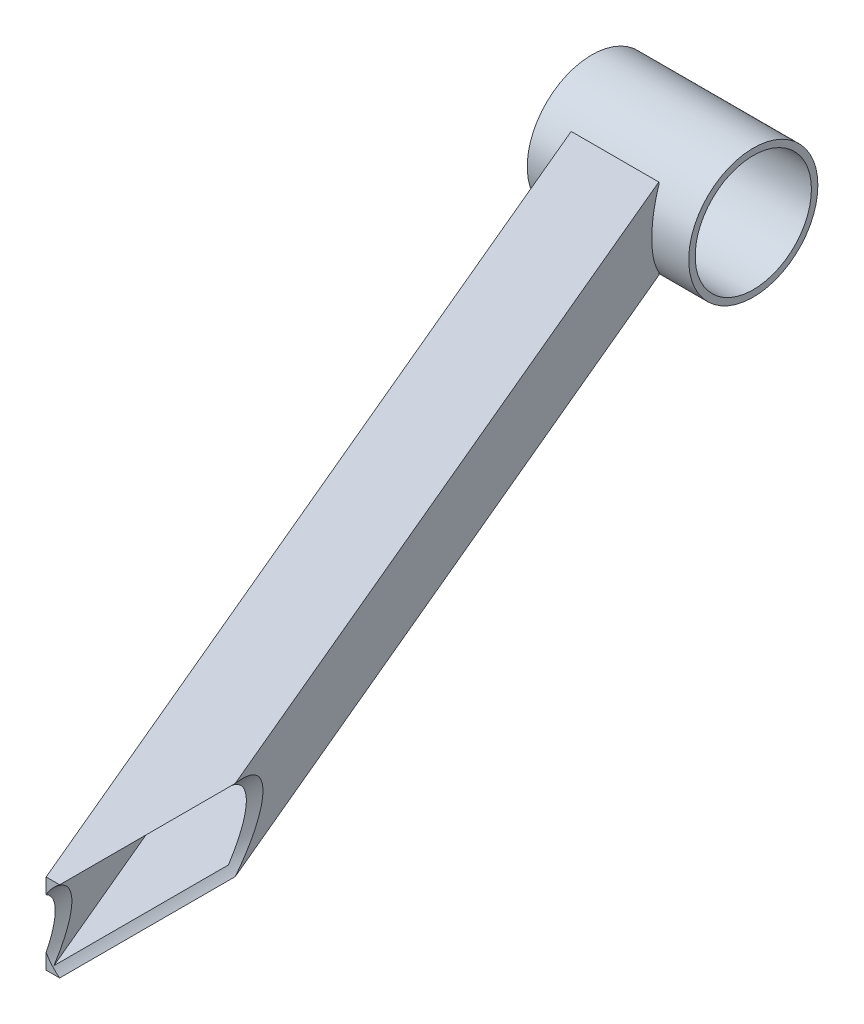
ISO-10303-21;
HEADER;
FILE_DESCRIPTION(('STEP AP214'),'2;1');
FILE_NAME('part.step','',(''),(''),'','','');
FILE_SCHEMA(('AUTOMOTIVE_DESIGN { 1 0 10303 214 1 1 1 1 }'));
ENDSEC;
DATA;
#1=APPLICATION_CONTEXT('core data for automotive mechanical design processes');
#2=APPLICATION_PROTOCOL_DEFINITION('international standard','automotive_design',2000,#1);
#3=PRODUCT_CONTEXT('',#1,'mechanical');
#4=PRODUCT('Part','Part','',(#3));
#5=PRODUCT_RELATED_PRODUCT_CATEGORY('part','',(#4));
#6=PRODUCT_DEFINITION_FORMATION('','',#4);
#7=PRODUCT_DEFINITION_CONTEXT('part definition',#1,'design');
#8=PRODUCT_DEFINITION('design','',#6,#7);
#9=PRODUCT_DEFINITION_SHAPE('','',#8);
#10=(LENGTH_UNIT() NAMED_UNIT(*) SI_UNIT(.MILLI.,.METRE.));
#11=(NAMED_UNIT(*) PLANE_ANGLE_UNIT() SI_UNIT($,.RADIAN.));
#12=(NAMED_UNIT(*) SI_UNIT($,.STERADIAN.) SOLID_ANGLE_UNIT());
#13=UNCERTAINTY_MEASURE_WITH_UNIT(LENGTH_MEASURE(1.E-05),#10,'distance_accuracy_value','');
#14=(GEOMETRIC_REPRESENTATION_CONTEXT(3) GLOBAL_UNCERTAINTY_ASSIGNED_CONTEXT((#13)) GLOBAL_UNIT_ASSIGNED_CONTEXT((#10,
#11,#12)) REPRESENTATION_CONTEXT('',''));
#15=CARTESIAN_POINT('',(0.,0.,0.));
#16=DIRECTION('',(0.,0.,1.));
#17=DIRECTION('',(1.,0.,0.));
#18=AXIS2_PLACEMENT_3D('',#15,#16,#17);
#19=CARTESIAN_POINT('',(113.650728546452,9.99999999999995,462.989935880595));
#20=DIRECTION('',(0.,0.,-1.));
#21=DIRECTION('',(0.,1.,0.));
#22=AXIS2_PLACEMENT_3D('',#19,#20,#21);
#23=PLANE('',#22);
#24=DIRECTION('',(1.,0.,0.));
#25=VECTOR('',#24,1.);
#26=CARTESIAN_POINT('',(113.650728546452,-10.0000000000001,462.989935880595));
#27=LINE('',#26,#25);
#28=CARTESIAN_POINT('',(102.797279016029,-10.0000000000001,462.989935880595));
#29=VERTEX_POINT('',#28);
#30=CARTESIAN_POINT('',(106.150728546452,-9.99999999999994,462.989935880595));
#31=VERTEX_POINT('',#30);
#32=EDGE_CURVE('E179',#29,#31,#27,.T.);
#33=ORIENTED_EDGE('',*,*,#32,.T.);
#34=CARTESIAN_POINT('',(113.650728546452,0.,462.989935880595));
#35=DIRECTION('',(0.,0.,-1.));
#36=DIRECTION('',(0.,1.,0.));
#37=AXIS2_PLACEMENT_3D('',#34,#35,#36);
#38=CIRCLE('',#37,12.5);
#39=CARTESIAN_POINT('',(102.797279016029,-6.20101873006179,462.989935880595));
#40=VERTEX_POINT('',#39);
#41=EDGE_CURVE('E503',#31,#40,#38,.T.);
#42=ORIENTED_EDGE('',*,*,#41,.T.);
#43=DIRECTION('',(0.,-1.,0.));
#44=VECTOR('',#43,1.);
#45=CARTESIAN_POINT('',(102.797279016029,9.99999999999995,462.989935880595));
#46=LINE('',#45,#44);
#47=EDGE_CURVE('E186',#40,#29,#46,.T.);
#48=ORIENTED_EDGE('',*,*,#47,.T.);
#49=EDGE_LOOP('',(#33,#42,#48));
#50=FACE_BOUND('',#49,.T.);
#51=ADVANCED_FACE('F44',(#50),#23,.F.);
#52=CARTESIAN_POINT('',(102.797279016029,9.99999999999995,462.989935880595));
#53=VERTEX_POINT('',#52);
#54=CARTESIAN_POINT('',(102.797279016029,6.20101873006165,462.989935880595));
#55=VERTEX_POINT('',#54);
#56=EDGE_CURVE('E196',#53,#55,#46,.T.);
#57=ORIENTED_EDGE('',*,*,#56,.T.);
#58=CARTESIAN_POINT('',(106.150728546452,9.99999999999995,462.989935880595));
#59=VERTEX_POINT('',#58);
#60=EDGE_CURVE('E499',#55,#59,#38,.T.);
#61=ORIENTED_EDGE('',*,*,#60,.T.);
#62=DIRECTION('',(1.,0.,0.));
#63=VECTOR('',#62,1.);
#64=CARTESIAN_POINT('',(113.650728546452,9.99999999999995,462.989935880595));
#65=LINE('',#64,#63);
#66=EDGE_CURVE('E175',#53,#59,#65,.T.);
#67=ORIENTED_EDGE('',*,*,#66,.F.);
#68=EDGE_LOOP('',(#57,#61,#67));
#69=FACE_BOUND('',#68,.T.);
#70=ADVANCED_FACE('F298',(#69),#23,.F.);
#71=CARTESIAN_POINT('',(0.,-10.,0.));
#72=DIRECTION('',(0.,1.,0.));
#73=DIRECTION('',(0.,0.,1.));
#74=AXIS2_PLACEMENT_3D('',#71,#72,#73);
#75=PLANE('',#74);
#76=DIRECTION('',(-0.38869601076738,0.,-0.921366057120363));
#77=VECTOR('',#76,1.);
#78=CARTESIAN_POINT('',(113.274761854631,-10.,436.371697818349));
#79=LINE('',#78,#77);
#80=CARTESIAN_POINT('',(106.150728546452,-10.,419.484870328165));
#81=VERTEX_POINT('',#80);
#82=CARTESIAN_POINT('',(29.5878417697601,-10.,238.));
#83=VERTEX_POINT('',#82);
#84=EDGE_CURVE('E173',#81,#83,#79,.T.);
#85=ORIENTED_EDGE('',*,*,#84,.F.);
#86=DIRECTION('',(0.,0.,-1.));
#87=VECTOR('',#86,1.);
#88=CARTESIAN_POINT('',(106.150728546452,-10.0000000000001,467.989935880595));
#89=LINE('',#88,#87);
#90=EDGE_CURVE('E261',#81,#31,#89,.F.);
#91=ORIENTED_EDGE('',*,*,#90,.T.);
#92=ORIENTED_EDGE('',*,*,#32,.F.);
#93=DIRECTION('',(0.38869601076738,0.,0.921366057120363));
#94=VECTOR('',#93,1.);
#95=CARTESIAN_POINT('',(102.797279016029,-10.0000000000001,462.989935880595));
#96=LINE('',#95,#94);
#97=CARTESIAN_POINT('',(7.88094270891566,-10.,238.));
#98=VERTEX_POINT('',#97);
#99=EDGE_CURVE('E191',#98,#29,#96,.T.);
#100=ORIENTED_EDGE('',*,*,#99,.F.);
#101=DIRECTION('',(-1.,0.,0.));
#102=VECTOR('',#101,1.);
#103=CARTESIAN_POINT('',(7.88094270891566,-10.,238.));
#104=LINE('',#103,#102);
#105=EDGE_CURVE('E188',#83,#98,#104,.T.);
#106=ORIENTED_EDGE('',*,*,#105,.F.);
#107=EDGE_LOOP('',(#85,#91,#92,#100,#106));
#108=FACE_BOUND('',#107,.T.);
#109=ADVANCED_FACE('F266',(#108),#75,.F.);
#110=CARTESIAN_POINT('',(0.,10.,0.));
#111=DIRECTION('',(0.,1.,0.));
#112=DIRECTION('',(0.,0.,1.));
#113=AXIS2_PLACEMENT_3D('',#110,#111,#112);
#114=PLANE('',#113);
#115=DIRECTION('',(0.,0.,-1.));
#116=VECTOR('',#115,1.);
#117=CARTESIAN_POINT('',(106.150728546452,9.99999999999995,467.989935880595));
#118=LINE('',#117,#116);
#119=CARTESIAN_POINT('',(106.150728546452,10.0000000000001,419.484870328165));
#120=VERTEX_POINT('',#119);
#121=EDGE_CURVE('E257',#120,#59,#118,.F.);
#122=ORIENTED_EDGE('',*,*,#121,.F.);
#123=DIRECTION('',(-0.38869601076738,0.,-0.921366057120363));
#124=VECTOR('',#123,1.);
#125=CARTESIAN_POINT('',(113.274761854631,9.99999999999995,436.371697818349));
#126=LINE('',#125,#124);
#127=CARTESIAN_POINT('',(29.5878417697601,9.99999999999997,238.));
#128=VERTEX_POINT('',#127);
#129=EDGE_CURVE('E178',#120,#128,#126,.T.);
#130=ORIENTED_EDGE('',*,*,#129,.T.);
#131=DIRECTION('',(-1.,0.,0.));
#132=VECTOR('',#131,1.);
#133=CARTESIAN_POINT('',(7.88094270891566,9.99999999999997,238.));
#134=LINE('',#133,#132);
#135=CARTESIAN_POINT('',(7.88094270891566,9.99999999999997,238.));
#136=VERTEX_POINT('',#135);
#137=EDGE_CURVE('E181',#128,#136,#134,.T.);
#138=ORIENTED_EDGE('',*,*,#137,.T.);
#139=DIRECTION('',(0.38869601076738,0.,0.921366057120363));
#140=VECTOR('',#139,1.);
#141=CARTESIAN_POINT('',(102.797279016029,9.99999999999995,462.989935880595));
#142=LINE('',#141,#140);
#143=EDGE_CURVE('E183',#136,#53,#142,.T.);
#144=ORIENTED_EDGE('',*,*,#143,.T.);
#145=ORIENTED_EDGE('',*,*,#66,.T.);
#146=EDGE_LOOP('',(#122,#130,#138,#144,#145));
#147=FACE_BOUND('',#146,.T.);
#148=ADVANCED_FACE('F255',(#147),#114,.T.);
#149=CARTESIAN_POINT('',(40.,0.,225.));
#150=DIRECTION('',(-1.,0.,0.));
#151=DIRECTION('',(0.,0.,1.));
#152=AXIS2_PLACEMENT_3D('',#149,#150,#151);
#153=CYLINDRICAL_SURFACE('',#152,14.4);
#154=CARTESIAN_POINT('',(40.,0.,225.));
#155=DIRECTION('',(1.,0.,0.));
#156=DIRECTION('',(0.,0.,-1.));
#157=AXIS2_PLACEMENT_3D('',#154,#155,#156);
#158=CIRCLE('',#157,14.4);
#159=CARTESIAN_POINT('',(40.,0.,210.6));
#160=VERTEX_POINT('',#159);
#161=EDGE_CURVE('E221',#160,#160,#158,.T.);
#162=ORIENTED_EDGE('',*,*,#161,.T.);
#163=EDGE_LOOP('',(#162));
#164=FACE_BOUND('',#163,.T.);
#165=CARTESIAN_POINT('',(0.,0.,225.));
#166=DIRECTION('',(1.,0.,0.));
#167=DIRECTION('',(0.,0.,-1.));
#168=AXIS2_PLACEMENT_3D('',#165,#166,#167);
#169=CIRCLE('',#168,14.4);
#170=CARTESIAN_POINT('',(0.,0.,210.6));
#171=VERTEX_POINT('',#170);
#172=EDGE_CURVE('E220',#171,#171,#169,.T.);
#173=ORIENTED_EDGE('',*,*,#172,.F.);
#174=EDGE_LOOP('',(#173));
#175=FACE_BOUND('',#174,.T.);
#176=DIRECTION('',(-1.,0.,0.));
#177=VECTOR('',#176,1.);
#178=CARTESIAN_POINT('',(40.,-6.1935450268808,238.));
#179=LINE('',#178,#177);
#180=CARTESIAN_POINT('',(7.88094270891566,-6.1935450268808,238.));
#181=VERTEX_POINT('',#180);
#182=CARTESIAN_POINT('',(29.5878417697601,-6.1935450268808,238.));
#183=VERTEX_POINT('',#182);
#184=EDGE_CURVE('E211',#181,#183,#179,.F.);
#185=ORIENTED_EDGE('',*,*,#184,.T.);
#186=CARTESIAN_POINT('',(24.1035414735579,0.,225.));
#187=DIRECTION('',(-0.921366057120363,0.,0.38869601076738));
#188=DIRECTION('',(-0.38869601076738,0.,-0.921366057120363));
#189=AXIS2_PLACEMENT_3D('',#186,#187,#188);
#190=ELLIPSE('',#189,15.628967323808,14.4);
#191=CARTESIAN_POINT('',(29.5878417697601,6.19354502688079,238.));
#192=VERTEX_POINT('',#191);
#193=EDGE_CURVE('E217',#183,#192,#190,.T.);
#194=ORIENTED_EDGE('',*,*,#193,.T.);
#195=DIRECTION('',(-1.,0.,0.));
#196=VECTOR('',#195,1.);
#197=CARTESIAN_POINT('',(40.,6.19354502688079,238.));
#198=LINE('',#197,#196);
#199=CARTESIAN_POINT('',(7.88094270891566,6.1935450268808,238.));
#200=VERTEX_POINT('',#199);
#201=EDGE_CURVE('E214',#192,#200,#198,.T.);
#202=ORIENTED_EDGE('',*,*,#201,.T.);
#203=CARTESIAN_POINT('',(2.39664241271337,0.,225.));
#204=DIRECTION('',(0.921366057120363,0.,-0.38869601076738));
#205=DIRECTION('',(-0.38869601076738,0.,-0.921366057120363));
#206=AXIS2_PLACEMENT_3D('',#203,#204,#205);
#207=ELLIPSE('',#206,15.628967323808,14.4);
#208=EDGE_CURVE('E207',#200,#181,#207,.T.);
#209=ORIENTED_EDGE('',*,*,#208,.T.);
#210=EDGE_LOOP('',(#185,#194,#202,#209));
#211=FACE_BOUND('',#210,.T.);
#212=ADVANCED_FACE('F46',(#164,#175,#211),#153,.F.);
#213=CARTESIAN_POINT('',(40.,0.,225.));
#214=DIRECTION('',(-1.,0.,0.));
#215=DIRECTION('',(0.,0.,1.));
#216=AXIS2_PLACEMENT_3D('',#213,#214,#215);
#217=CYLINDRICAL_SURFACE('',#216,16.);
#218=CARTESIAN_POINT('',(0.,0.,225.));
#219=DIRECTION('',(1.,0.,0.));
#220=DIRECTION('',(0.,0.,-1.));
#221=AXIS2_PLACEMENT_3D('',#218,#219,#220);
#222=CIRCLE('',#221,16.);
#223=CARTESIAN_POINT('',(0.,0.,209.));
#224=VERTEX_POINT('',#223);
#225=EDGE_CURVE('E225',#224,#224,#222,.T.);
#226=ORIENTED_EDGE('',*,*,#225,.T.);
#227=EDGE_LOOP('',(#226));
#228=FACE_BOUND('',#227,.T.);
#229=CARTESIAN_POINT('',(40.,0.,225.));
#230=DIRECTION('',(1.,0.,0.));
#231=DIRECTION('',(0.,0.,-1.));
#232=AXIS2_PLACEMENT_3D('',#229,#230,#231);
#233=CIRCLE('',#232,16.);
#234=CARTESIAN_POINT('',(40.,0.,209.));
#235=VERTEX_POINT('',#234);
#236=EDGE_CURVE('E224',#235,#235,#233,.T.);
#237=ORIENTED_EDGE('',*,*,#236,.F.);
#238=EDGE_LOOP('',(#237));
#239=FACE_BOUND('',#238,.T.);
#240=CARTESIAN_POINT('',(24.1035414735579,0.,225.));
#241=DIRECTION('',(-0.921366057120363,0.,0.38869601076738));
#242=DIRECTION('',(-0.38869601076738,0.,-0.921366057120363));
#243=AXIS2_PLACEMENT_3D('',#240,#241,#242);
#244=ELLIPSE('',#243,17.3655192486756,16.);
#245=CARTESIAN_POINT('',(29.5878417697601,-9.32737905308884,238.));
#246=VERTEX_POINT('',#245);
#247=CARTESIAN_POINT('',(29.5878417697601,9.32737905308884,238.));
#248=VERTEX_POINT('',#247);
#249=EDGE_CURVE('E52',#246,#248,#244,.T.);
#250=ORIENTED_EDGE('',*,*,#249,.F.);
#251=DIRECTION('',(-1.,0.,0.));
#252=VECTOR('',#251,1.);
#253=CARTESIAN_POINT('',(40.,-9.32737905308884,238.));
#254=LINE('',#253,#252);
#255=CARTESIAN_POINT('',(7.88094270891566,-9.32737905308884,238.));
#256=VERTEX_POINT('',#255);
#257=EDGE_CURVE('E235',#256,#246,#254,.F.);
#258=ORIENTED_EDGE('',*,*,#257,.F.);
#259=CARTESIAN_POINT('',(2.39664241271337,0.,225.));
#260=DIRECTION('',(0.921366057120363,0.,-0.38869601076738));
#261=DIRECTION('',(-0.38869601076738,0.,-0.921366057120363));
#262=AXIS2_PLACEMENT_3D('',#259,#260,#261);
#263=ELLIPSE('',#262,17.3655192486756,16.);
#264=CARTESIAN_POINT('',(7.88094270891566,9.32737905308884,238.));
#265=VERTEX_POINT('',#264);
#266=EDGE_CURVE('E228',#265,#256,#263,.T.);
#267=ORIENTED_EDGE('',*,*,#266,.F.);
#268=DIRECTION('',(-1.,0.,0.));
#269=VECTOR('',#268,1.);
#270=CARTESIAN_POINT('',(40.,9.32737905308884,238.));
#271=LINE('',#270,#269);
#272=EDGE_CURVE('E238',#248,#265,#271,.T.);
#273=ORIENTED_EDGE('',*,*,#272,.F.);
#274=EDGE_LOOP('',(#250,#258,#267,#273));
#275=FACE_BOUND('',#274,.T.);
#276=ADVANCED_FACE('F282',(#228,#239,#275),#217,.T.);
#277=CARTESIAN_POINT('',(40.,0.,0.));
#278=DIRECTION('',(1.,0.,0.));
#279=DIRECTION('',(0.,0.,-1.));
#280=AXIS2_PLACEMENT_3D('',#277,#278,#279);
#281=PLANE('',#280);
#282=ORIENTED_EDGE('',*,*,#161,.F.);
#283=EDGE_LOOP('',(#282));
#284=FACE_BOUND('',#283,.T.);
#285=ORIENTED_EDGE('',*,*,#236,.T.);
#286=EDGE_LOOP('',(#285));
#287=FACE_BOUND('',#286,.T.);
#288=ADVANCED_FACE('F284',(#284,#287),#281,.T.);
#289=CARTESIAN_POINT('',(0.,0.,0.));
#290=DIRECTION('',(1.,0.,0.));
#291=DIRECTION('',(0.,0.,-1.));
#292=AXIS2_PLACEMENT_3D('',#289,#290,#291);
#293=PLANE('',#292);
#294=ORIENTED_EDGE('',*,*,#172,.T.);
#295=EDGE_LOOP('',(#294));
#296=FACE_BOUND('',#295,.T.);
#297=ORIENTED_EDGE('',*,*,#225,.F.);
#298=EDGE_LOOP('',(#297));
#299=FACE_BOUND('',#298,.T.);
#300=ADVANCED_FACE('F291',(#296,#299),#293,.F.);
#301=CARTESIAN_POINT('',(102.797279016029,9.99999999999995,462.989935880595));
#302=DIRECTION('',(0.921366057120363,0.,-0.38869601076738));
#303=DIRECTION('',(-0.38869601076738,0.,-0.921366057120363));
#304=AXIS2_PLACEMENT_3D('',#301,#302,#303);
#305=PLANE('',#304);
#306=ORIENTED_EDGE('',*,*,#47,.F.);
#307=CARTESIAN_POINT('',(113.650728546452,0.,488.716981497188));
#308=DIRECTION('',(0.921366057120363,0.,-0.38869601076738));
#309=DIRECTION('',(-0.38869601076738,0.,-0.921366057120363));
#310=AXIS2_PLACEMENT_3D('',#307,#308,#309);
#311=ELLIPSE('',#310,32.1588070207409,12.5);
#312=EDGE_CURVE('E505',#40,#55,#311,.T.);
#313=ORIENTED_EDGE('',*,*,#312,.T.);
#314=ORIENTED_EDGE('',*,*,#56,.F.);
#315=ORIENTED_EDGE('',*,*,#143,.F.);
#316=DIRECTION('',(0.,-1.,0.));
#317=VECTOR('',#316,1.);
#318=CARTESIAN_POINT('',(7.88094270891566,9.99999999999997,238.));
#319=LINE('',#318,#317);
#320=EDGE_CURVE('E200',#136,#265,#319,.T.);
#321=ORIENTED_EDGE('',*,*,#320,.T.);
#322=ORIENTED_EDGE('',*,*,#266,.T.);
#323=EDGE_CURVE('E199',#256,#98,#319,.T.);
#324=ORIENTED_EDGE('',*,*,#323,.T.);
#325=ORIENTED_EDGE('',*,*,#99,.T.);
#326=EDGE_LOOP('',(#306,#313,#314,#315,#321,#322,#324,#325));
#327=FACE_BOUND('',#326,.T.);
#328=ADVANCED_FACE('F281',(#327),#305,.F.);
#329=CARTESIAN_POINT('',(113.274761854631,9.99999999999995,436.371697818349));
#330=DIRECTION('',(-0.921366057120363,0.,0.38869601076738));
#331=DIRECTION('',(0.38869601076738,0.,0.921366057120363));
#332=AXIS2_PLACEMENT_3D('',#329,#330,#331);
#333=PLANE('',#332);
#334=ORIENTED_EDGE('',*,*,#129,.F.);
#335=CARTESIAN_POINT('',(113.650728546452,0.,437.262890264002));
#336=DIRECTION('',(-0.921366057120363,0.,0.38869601076738));
#337=DIRECTION('',(-0.38869601076738,0.,-0.921366057120363));
#338=AXIS2_PLACEMENT_3D('',#335,#336,#337);
#339=ELLIPSE('',#338,32.1588070207409,12.5);
#340=EDGE_CURVE('E259',#120,#81,#339,.T.);
#341=ORIENTED_EDGE('',*,*,#340,.T.);
#342=ORIENTED_EDGE('',*,*,#84,.T.);
#343=DIRECTION('',(0.,-1.,0.));
#344=VECTOR('',#343,1.);
#345=CARTESIAN_POINT('',(29.5878417697601,9.99999999999997,238.));
#346=LINE('',#345,#344);
#347=EDGE_CURVE('E203',#246,#83,#346,.T.);
#348=ORIENTED_EDGE('',*,*,#347,.F.);
#349=ORIENTED_EDGE('',*,*,#249,.T.);
#350=EDGE_CURVE('E204',#128,#248,#346,.T.);
#351=ORIENTED_EDGE('',*,*,#350,.F.);
#352=EDGE_LOOP('',(#334,#341,#342,#348,#349,#351));
#353=FACE_BOUND('',#352,.T.);
#354=ADVANCED_FACE('F245',(#353),#333,.F.);
#355=CARTESIAN_POINT('',(7.88094270891566,9.99999999999997,238.));
#356=DIRECTION('',(0.,0.,1.));
#357=DIRECTION('',(0.,-1.,0.));
#358=AXIS2_PLACEMENT_3D('',#355,#356,#357);
#359=PLANE('',#358);
#360=ORIENTED_EDGE('',*,*,#323,.F.);
#361=ORIENTED_EDGE('',*,*,#257,.T.);
#362=ORIENTED_EDGE('',*,*,#347,.T.);
#363=ORIENTED_EDGE('',*,*,#105,.T.);
#364=EDGE_LOOP('',(#360,#361,#362,#363));
#365=FACE_BOUND('',#364,.T.);
#366=ADVANCED_FACE('F271',(#365),#359,.F.);
#367=ORIENTED_EDGE('',*,*,#350,.T.);
#368=ORIENTED_EDGE('',*,*,#272,.T.);
#369=ORIENTED_EDGE('',*,*,#320,.F.);
#370=ORIENTED_EDGE('',*,*,#137,.F.);
#371=EDGE_LOOP('',(#367,#368,#369,#370));
#372=FACE_BOUND('',#371,.T.);
#373=ADVANCED_FACE('F250',(#372),#359,.F.);
#374=ORIENTED_EDGE('',*,*,#193,.F.);
#375=EDGE_CURVE('E208',#192,#183,#346,.T.);
#376=ORIENTED_EDGE('',*,*,#375,.F.);
#377=EDGE_LOOP('',(#374,#376));
#378=FACE_BOUND('',#377,.T.);
#379=ADVANCED_FACE('F315',(#378),#333,.F.);
#380=ORIENTED_EDGE('',*,*,#208,.F.);
#381=EDGE_CURVE('E66',#200,#181,#319,.T.);
#382=ORIENTED_EDGE('',*,*,#381,.T.);
#383=EDGE_LOOP('',(#380,#382));
#384=FACE_BOUND('',#383,.T.);
#385=ADVANCED_FACE('F278',(#384),#305,.F.);
#386=ORIENTED_EDGE('',*,*,#201,.F.);
#387=ORIENTED_EDGE('',*,*,#375,.T.);
#388=ORIENTED_EDGE('',*,*,#184,.F.);
#389=ORIENTED_EDGE('',*,*,#381,.F.);
#390=EDGE_LOOP('',(#386,#387,#388,#389));
#391=FACE_BOUND('',#390,.T.);
#392=ADVANCED_FACE('F275',(#391),#359,.F.);
#393=CARTESIAN_POINT('',(113.650728546452,0.,-543.71784351505));
#394=DIRECTION('',(0.,0.,1.));
#395=DIRECTION('',(1.,0.,0.));
#396=AXIS2_PLACEMENT_3D('',#393,#394,#395);
#397=CYLINDRICAL_SURFACE('',#396,12.5);
#398=CARTESIAN_POINT('',(113.650728546452,0.,441.379217562657));
#399=DIRECTION('',(-0.921366057120363,0.,0.38869601076738));
#400=DIRECTION('',(-0.38869601076738,0.,-0.921366057120363));
#401=AXIS2_PLACEMENT_3D('',#398,#399,#400);
#402=ELLIPSE('',#401,32.1588070207409,12.5);
#403=CARTESIAN_POINT('',(104.393839220118,8.40000000000001,419.43666249767));
#404=VERTEX_POINT('',#403);
#405=CARTESIAN_POINT('',(104.393839220117,-8.39999999999994,419.43666249767));
#406=VERTEX_POINT('',#405);
#407=EDGE_CURVE('E11',#404,#406,#402,.T.);
#408=ORIENTED_EDGE('',*,*,#407,.T.);
#409=DIRECTION('',(0.,0.,-1.));
#410=VECTOR('',#409,1.);
#411=CARTESIAN_POINT('',(104.393839220118,-8.40000000000005,467.989935880595));
#412=LINE('',#411,#410);
#413=CARTESIAN_POINT('',(104.393839220118,-8.40000000000004,462.658099133546));
#414=VERTEX_POINT('',#413);
#415=EDGE_CURVE('E495',#406,#414,#412,.F.);
#416=ORIENTED_EDGE('',*,*,#415,.T.);
#417=CARTESIAN_POINT('',(113.650728546452,0.,484.600654198533));
#418=DIRECTION('',(0.921366057120363,0.,-0.38869601076738));
#419=DIRECTION('',(-0.38869601076738,0.,-0.921366057120363));
#420=AXIS2_PLACEMENT_3D('',#417,#418,#419);
#421=ELLIPSE('',#420,32.1588070207409,12.5);
#422=CARTESIAN_POINT('',(104.393839220118,8.39999999999995,462.658099133546));
#423=VERTEX_POINT('',#422);
#424=EDGE_CURVE('E59',#414,#423,#421,.T.);
#425=ORIENTED_EDGE('',*,*,#424,.T.);
#426=DIRECTION('',(0.,0.,-1.));
#427=VECTOR('',#426,1.);
#428=CARTESIAN_POINT('',(104.393839220118,8.39999999999995,467.989935880595));
#429=LINE('',#428,#427);
#430=EDGE_CURVE('E141',#404,#423,#429,.F.);
#431=ORIENTED_EDGE('',*,*,#430,.F.);
#432=EDGE_LOOP('',(#408,#416,#425,#431));
#433=FACE_BOUND('',#432,.T.);
#434=ORIENTED_EDGE('',*,*,#121,.T.);
#435=ORIENTED_EDGE('',*,*,#60,.F.);
#436=ORIENTED_EDGE('',*,*,#312,.F.);
#437=ORIENTED_EDGE('',*,*,#41,.F.);
#438=ORIENTED_EDGE('',*,*,#90,.F.);
#439=ORIENTED_EDGE('',*,*,#340,.F.);
#440=EDGE_LOOP('',(#434,#435,#436,#437,#438,#439));
#441=FACE_BOUND('',#440,.T.);
#442=ADVANCED_FACE('F143',(#433,#441),#397,.F.);
#443=CARTESIAN_POINT('',(7.88094270891566,9.99999999999997,239.6));
#444=DIRECTION('',(0.,0.,1.));
#445=DIRECTION('',(0.,-1.,0.));
#446=AXIS2_PLACEMENT_3D('',#443,#444,#445);
#447=PLANE('',#446);
#448=DIRECTION('',(0.,-1.,0.));
#449=VECTOR('',#448,1.);
#450=CARTESIAN_POINT('',(10.2924854394697,9.99999999999997,239.6));
#451=LINE('',#450,#449);
#452=CARTESIAN_POINT('',(10.2924854394696,8.39999999999997,239.6));
#453=VERTEX_POINT('',#452);
#454=CARTESIAN_POINT('',(10.2924854394696,-8.40000000000003,239.6));
#455=VERTEX_POINT('',#454);
#456=EDGE_CURVE('E174',#453,#455,#451,.T.);
#457=ORIENTED_EDGE('',*,*,#456,.T.);
#458=DIRECTION('',(-1.,0.,0.));
#459=VECTOR('',#458,1.);
#460=CARTESIAN_POINT('',(7.88094270891566,-8.40000000000003,239.6));
#461=LINE('',#460,#459);
#462=CARTESIAN_POINT('',(28.526280650579,-8.40000000000003,239.6));
#463=VERTEX_POINT('',#462);
#464=EDGE_CURVE('E166',#463,#455,#461,.T.);
#465=ORIENTED_EDGE('',*,*,#464,.F.);
#466=DIRECTION('',(0.,-1.,0.));
#467=VECTOR('',#466,1.);
#468=CARTESIAN_POINT('',(28.526280650579,9.99999999999997,239.6));
#469=LINE('',#468,#467);
#470=CARTESIAN_POINT('',(28.526280650579,8.39999999999997,239.6));
#471=VERTEX_POINT('',#470);
#472=EDGE_CURVE('E171',#471,#463,#469,.T.);
#473=ORIENTED_EDGE('',*,*,#472,.F.);
#474=DIRECTION('',(-1.,0.,0.));
#475=VECTOR('',#474,1.);
#476=CARTESIAN_POINT('',(7.88094270891566,8.39999999999997,239.6));
#477=LINE('',#476,#475);
#478=EDGE_CURVE('E159',#471,#453,#477,.T.);
#479=ORIENTED_EDGE('',*,*,#478,.T.);
#480=EDGE_LOOP('',(#457,#465,#473,#479));
#481=FACE_BOUND('',#480,.T.);
#482=ADVANCED_FACE('F375',(#481),#447,.T.);
#483=CARTESIAN_POINT('',(104.271464707422,9.99999999999995,462.368022263367));
#484=DIRECTION('',(0.921366057120363,0.,-0.38869601076738));
#485=DIRECTION('',(-0.38869601076738,0.,-0.921366057120363));
#486=AXIS2_PLACEMENT_3D('',#483,#484,#485);
#487=PLANE('',#486);
#488=ORIENTED_EDGE('',*,*,#424,.F.);
#489=DIRECTION('',(0.38869601076738,0.,0.921366057120363));
#490=VECTOR('',#489,1.);
#491=CARTESIAN_POINT('',(104.271464707422,-8.40000000000005,462.368022263367));
#492=LINE('',#491,#490);
#493=EDGE_CURVE('E161',#455,#414,#492,.T.);
#494=ORIENTED_EDGE('',*,*,#493,.F.);
#495=ORIENTED_EDGE('',*,*,#456,.F.);
#496=DIRECTION('',(0.38869601076738,0.,0.921366057120363));
#497=VECTOR('',#496,1.);
#498=CARTESIAN_POINT('',(104.271464707422,8.39999999999995,462.368022263367));
#499=LINE('',#498,#497);
#500=EDGE_CURVE('E163',#453,#423,#499,.T.);
#501=ORIENTED_EDGE('',*,*,#500,.T.);
#502=EDGE_LOOP('',(#488,#494,#495,#501));
#503=FACE_BOUND('',#502,.T.);
#504=ADVANCED_FACE('F383',(#503),#487,.T.);
#505=CARTESIAN_POINT('',(111.800576163238,9.99999999999995,436.993611435577));
#506=DIRECTION('',(-0.921366057120363,0.,0.38869601076738));
#507=DIRECTION('',(0.38869601076738,0.,0.921366057120363));
#508=AXIS2_PLACEMENT_3D('',#505,#506,#507);
#509=PLANE('',#508);
#510=DIRECTION('',(-0.38869601076738,0.,-0.921366057120363));
#511=VECTOR('',#510,1.);
#512=CARTESIAN_POINT('',(111.800576163238,-8.40000000000005,436.993611435577));
#513=LINE('',#512,#511);
#514=EDGE_CURVE('E156',#406,#463,#513,.T.);
#515=ORIENTED_EDGE('',*,*,#514,.F.);
#516=ORIENTED_EDGE('',*,*,#407,.F.);
#517=DIRECTION('',(-0.38869601076738,0.,-0.921366057120363));
#518=VECTOR('',#517,1.);
#519=CARTESIAN_POINT('',(111.800576163238,8.39999999999995,436.993611435577));
#520=LINE('',#519,#518);
#521=EDGE_CURVE('E154',#404,#471,#520,.T.);
#522=ORIENTED_EDGE('',*,*,#521,.T.);
#523=ORIENTED_EDGE('',*,*,#472,.T.);
#524=EDGE_LOOP('',(#515,#516,#522,#523));
#525=FACE_BOUND('',#524,.T.);
#526=ADVANCED_FACE('F152',(#525),#509,.T.);
#527=CARTESIAN_POINT('',(0.,-8.4,0.));
#528=DIRECTION('',(0.,1.,0.));
#529=DIRECTION('',(0.,0.,1.));
#530=AXIS2_PLACEMENT_3D('',#527,#528,#529);
#531=PLANE('',#530);
#532=ORIENTED_EDGE('',*,*,#415,.F.);
#533=ORIENTED_EDGE('',*,*,#514,.T.);
#534=ORIENTED_EDGE('',*,*,#464,.T.);
#535=ORIENTED_EDGE('',*,*,#493,.T.);
#536=EDGE_LOOP('',(#532,#533,#534,#535));
#537=FACE_BOUND('',#536,.T.);
#538=ADVANCED_FACE('F400',(#537),#531,.T.);
#539=CARTESIAN_POINT('',(0.,8.4,0.));
#540=DIRECTION('',(0.,1.,0.));
#541=DIRECTION('',(0.,0.,1.));
#542=AXIS2_PLACEMENT_3D('',#539,#540,#541);
#543=PLANE('',#542);
#544=ORIENTED_EDGE('',*,*,#521,.F.);
#545=ORIENTED_EDGE('',*,*,#430,.T.);
#546=ORIENTED_EDGE('',*,*,#500,.F.);
#547=ORIENTED_EDGE('',*,*,#478,.F.);
#548=EDGE_LOOP('',(#544,#545,#546,#547));
#549=FACE_BOUND('',#548,.T.);
#550=ADVANCED_FACE('F157',(#549),#543,.F.);
#551=CLOSED_SHELL('',(#51,#70,#109,#148,#212,#276,#288,#300,#328,#354,#366,#373,#379,#385,#392,
#442,#482,#504,#526,#538,#550));
#552=MANIFOLD_SOLID_BREP('B2',#551);
#553=ADVANCED_BREP_SHAPE_REPRESENTATION('',(#18,#552),#14);
#554=SHAPE_DEFINITION_REPRESENTATION(#9,#553);
ENDSEC;
END-ISO-10303-21;
